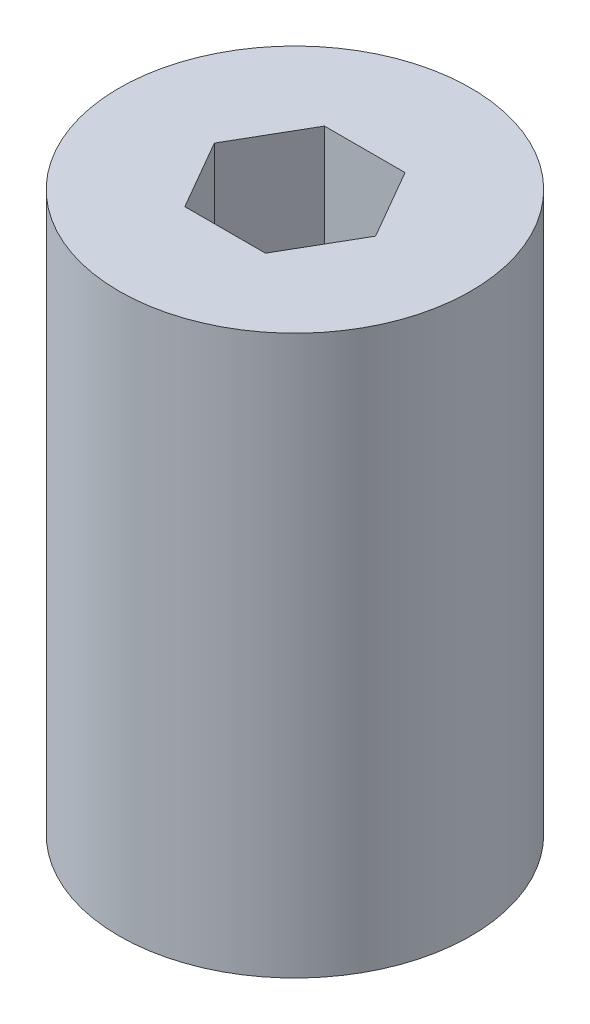
ISO-10303-21;
HEADER;
FILE_DESCRIPTION(('STEP AP214'),'2;1');
FILE_NAME('part.step','',(''),(''),'','','');
FILE_SCHEMA(('AUTOMOTIVE_DESIGN { 1 0 10303 214 1 1 1 1 }'));
ENDSEC;
DATA;
#1=APPLICATION_CONTEXT('core data for automotive mechanical design processes');
#2=APPLICATION_PROTOCOL_DEFINITION('international standard','automotive_design',2000,#1);
#3=PRODUCT_CONTEXT('',#1,'mechanical');
#4=PRODUCT('Part','Part','',(#3));
#5=PRODUCT_RELATED_PRODUCT_CATEGORY('part','',(#4));
#6=PRODUCT_DEFINITION_FORMATION('','',#4);
#7=PRODUCT_DEFINITION_CONTEXT('part definition',#1,'design');
#8=PRODUCT_DEFINITION('design','',#6,#7);
#9=PRODUCT_DEFINITION_SHAPE('','',#8);
#10=(LENGTH_UNIT() NAMED_UNIT(*) SI_UNIT(.MILLI.,.METRE.));
#11=(NAMED_UNIT(*) PLANE_ANGLE_UNIT() SI_UNIT($,.RADIAN.));
#12=(NAMED_UNIT(*) SI_UNIT($,.STERADIAN.) SOLID_ANGLE_UNIT());
#13=UNCERTAINTY_MEASURE_WITH_UNIT(LENGTH_MEASURE(1.E-05),#10,'distance_accuracy_value','');
#14=(GEOMETRIC_REPRESENTATION_CONTEXT(3) GLOBAL_UNCERTAINTY_ASSIGNED_CONTEXT((#13)) GLOBAL_UNIT_ASSIGNED_CONTEXT((#10,
#11,#12)) REPRESENTATION_CONTEXT('',''));
#15=CARTESIAN_POINT('',(0.,0.,0.));
#16=DIRECTION('',(0.,0.,1.));
#17=DIRECTION('',(1.,0.,0.));
#18=AXIS2_PLACEMENT_3D('',#15,#16,#17);
#19=CARTESIAN_POINT('',(0.,50.8,0.));
#20=DIRECTION('',(0.,-1.,0.));
#21=DIRECTION('',(0.,0.,-1.));
#22=AXIS2_PLACEMENT_3D('',#19,#20,#21);
#23=CYLINDRICAL_SURFACE('',#22,16.002);
#24=CARTESIAN_POINT('',(0.,50.8,0.));
#25=DIRECTION('',(0.,1.,0.));
#26=DIRECTION('',(0.,0.,1.));
#27=AXIS2_PLACEMENT_3D('',#24,#25,#26);
#28=CIRCLE('',#27,16.002);
#29=CARTESIAN_POINT('',(0.,50.8,16.002));
#30=VERTEX_POINT('',#29);
#31=EDGE_CURVE('E11',#30,#30,#28,.T.);
#32=ORIENTED_EDGE('',*,*,#31,.F.);
#33=EDGE_LOOP('',(#32));
#34=FACE_BOUND('',#33,.T.);
#35=CARTESIAN_POINT('',(0.,0.,0.));
#36=DIRECTION('',(0.,1.,0.));
#37=DIRECTION('',(0.,0.,1.));
#38=AXIS2_PLACEMENT_3D('',#35,#36,#37);
#39=CIRCLE('',#38,16.002);
#40=CARTESIAN_POINT('',(0.,0.,16.002));
#41=VERTEX_POINT('',#40);
#42=EDGE_CURVE('E36',#41,#41,#39,.T.);
#43=ORIENTED_EDGE('',*,*,#42,.T.);
#44=EDGE_LOOP('',(#43));
#45=FACE_BOUND('',#44,.T.);
#46=ADVANCED_FACE('F33',(#34,#45),#23,.T.);
#47=CARTESIAN_POINT('',(0.,50.8,0.));
#48=DIRECTION('',(0.,1.,0.));
#49=DIRECTION('',(0.,0.,1.));
#50=AXIS2_PLACEMENT_3D('',#47,#48,#49);
#51=PLANE('',#50);
#52=DIRECTION('',(0.5,0.,-0.866025403784439));
#53=VECTOR('',#52,1.);
#54=CARTESIAN_POINT('',(3.66617420935413,50.8,6.35000000000001));
#55=LINE('',#54,#53);
#56=CARTESIAN_POINT('',(3.66617420935413,50.8,6.35000000000001));
#57=VERTEX_POINT('',#56);
#58=CARTESIAN_POINT('',(7.33234841870825,50.8,0.));
#59=VERTEX_POINT('',#58);
#60=EDGE_CURVE('E47',#57,#59,#55,.T.);
#61=ORIENTED_EDGE('',*,*,#60,.F.);
#62=DIRECTION('',(1.,0.,0.));
#63=VECTOR('',#62,1.);
#64=CARTESIAN_POINT('',(-3.66617420935412,50.8,6.35000000000001));
#65=LINE('',#64,#63);
#66=CARTESIAN_POINT('',(-3.66617420935412,50.8,6.35000000000001));
#67=VERTEX_POINT('',#66);
#68=EDGE_CURVE('E104',#67,#57,#65,.T.);
#69=ORIENTED_EDGE('',*,*,#68,.F.);
#70=DIRECTION('',(0.5,0.,0.866025403784439));
#71=VECTOR('',#70,1.);
#72=CARTESIAN_POINT('',(-7.33234841870825,50.8,0.));
#73=LINE('',#72,#71);
#74=CARTESIAN_POINT('',(-7.33234841870825,50.8,0.));
#75=VERTEX_POINT('',#74);
#76=EDGE_CURVE('E107',#75,#67,#73,.T.);
#77=ORIENTED_EDGE('',*,*,#76,.F.);
#78=DIRECTION('',(-0.5,0.,0.866025403784439));
#79=VECTOR('',#78,1.);
#80=CARTESIAN_POINT('',(-3.66617420935413,50.8,-6.35));
#81=LINE('',#80,#79);
#82=CARTESIAN_POINT('',(-3.66617420935413,50.8,-6.35));
#83=VERTEX_POINT('',#82);
#84=EDGE_CURVE('E123',#83,#75,#81,.T.);
#85=ORIENTED_EDGE('',*,*,#84,.F.);
#86=DIRECTION('',(-1.,0.,0.));
#87=VECTOR('',#86,1.);
#88=CARTESIAN_POINT('',(3.66617420935412,50.8,-6.35000000000001));
#89=LINE('',#88,#87);
#90=CARTESIAN_POINT('',(3.66617420935412,50.8,-6.35000000000001));
#91=VERTEX_POINT('',#90);
#92=EDGE_CURVE('E120',#91,#83,#89,.T.);
#93=ORIENTED_EDGE('',*,*,#92,.F.);
#94=DIRECTION('',(-0.5,0.,-0.866025403784439));
#95=VECTOR('',#94,1.);
#96=CARTESIAN_POINT('',(7.33234841870825,50.8,0.));
#97=LINE('',#96,#95);
#98=EDGE_CURVE('E118',#59,#91,#97,.T.);
#99=ORIENTED_EDGE('',*,*,#98,.F.);
#100=EDGE_LOOP('',(#61,#69,#77,#85,#93,#99));
#101=FACE_BOUND('',#100,.T.);
#102=ORIENTED_EDGE('',*,*,#31,.T.);
#103=EDGE_LOOP('',(#102));
#104=FACE_BOUND('',#103,.T.);
#105=ADVANCED_FACE('F140',(#101,#104),#51,.T.);
#106=CARTESIAN_POINT('',(0.,0.,0.));
#107=DIRECTION('',(0.,1.,0.));
#108=DIRECTION('',(0.,0.,1.));
#109=AXIS2_PLACEMENT_3D('',#106,#107,#108);
#110=PLANE('',#109);
#111=DIRECTION('',(1.,0.,0.));
#112=VECTOR('',#111,1.);
#113=CARTESIAN_POINT('',(-3.66617420935412,0.,6.35000000000001));
#114=LINE('',#113,#112);
#115=CARTESIAN_POINT('',(-3.66617420935412,0.,6.35000000000001));
#116=VERTEX_POINT('',#115);
#117=CARTESIAN_POINT('',(3.66617420935413,0.,6.35000000000001));
#118=VERTEX_POINT('',#117);
#119=EDGE_CURVE('E93',#116,#118,#114,.T.);
#120=ORIENTED_EDGE('',*,*,#119,.T.);
#121=DIRECTION('',(0.5,0.,-0.866025403784439));
#122=VECTOR('',#121,1.);
#123=CARTESIAN_POINT('',(3.66617420935413,0.,6.35000000000001));
#124=LINE('',#123,#122);
#125=CARTESIAN_POINT('',(7.33234841870825,0.,0.));
#126=VERTEX_POINT('',#125);
#127=EDGE_CURVE('E87',#118,#126,#124,.T.);
#128=ORIENTED_EDGE('',*,*,#127,.T.);
#129=DIRECTION('',(-0.5,0.,-0.866025403784439));
#130=VECTOR('',#129,1.);
#131=CARTESIAN_POINT('',(7.33234841870825,0.,0.));
#132=LINE('',#131,#130);
#133=CARTESIAN_POINT('',(3.66617420935413,0.,-6.35));
#134=VERTEX_POINT('',#133);
#135=EDGE_CURVE('E96',#126,#134,#132,.T.);
#136=ORIENTED_EDGE('',*,*,#135,.T.);
#137=DIRECTION('',(-1.,0.,0.));
#138=VECTOR('',#137,1.);
#139=CARTESIAN_POINT('',(3.66617420935412,0.,-6.35000000000001));
#140=LINE('',#139,#138);
#141=CARTESIAN_POINT('',(-3.66617420935413,0.,-6.35));
#142=VERTEX_POINT('',#141);
#143=EDGE_CURVE('E55',#134,#142,#140,.T.);
#144=ORIENTED_EDGE('',*,*,#143,.T.);
#145=DIRECTION('',(-0.5,0.,0.866025403784439));
#146=VECTOR('',#145,1.);
#147=CARTESIAN_POINT('',(-3.66617420935413,0.,-6.35));
#148=LINE('',#147,#146);
#149=CARTESIAN_POINT('',(-7.33234841870825,0.,0.));
#150=VERTEX_POINT('',#149);
#151=EDGE_CURVE('E111',#142,#150,#148,.T.);
#152=ORIENTED_EDGE('',*,*,#151,.T.);
#153=DIRECTION('',(0.5,0.,0.866025403784439));
#154=VECTOR('',#153,1.);
#155=CARTESIAN_POINT('',(-7.33234841870825,0.,0.));
#156=LINE('',#155,#154);
#157=EDGE_CURVE('E114',#150,#116,#156,.T.);
#158=ORIENTED_EDGE('',*,*,#157,.T.);
#159=EDGE_LOOP('',(#120,#128,#136,#144,#152,#158));
#160=FACE_BOUND('',#159,.T.);
#161=ORIENTED_EDGE('',*,*,#42,.F.);
#162=EDGE_LOOP('',(#161));
#163=FACE_BOUND('',#162,.T.);
#164=ADVANCED_FACE('F100',(#160,#163),#110,.F.);
#165=CARTESIAN_POINT('',(3.66617420935413,0.,6.35000000000001));
#166=DIRECTION('',(0.866025403784439,0.,0.5));
#167=DIRECTION('',(0.5,0.,-0.866025403784439));
#168=AXIS2_PLACEMENT_3D('',#165,#166,#167);
#169=PLANE('',#168);
#170=ORIENTED_EDGE('',*,*,#60,.T.);
#171=DIRECTION('',(0.,1.,0.));
#172=VECTOR('',#171,1.);
#173=CARTESIAN_POINT('',(7.33234841870825,0.,0.));
#174=LINE('',#173,#172);
#175=EDGE_CURVE('E83',#126,#59,#174,.T.);
#176=ORIENTED_EDGE('',*,*,#175,.F.);
#177=ORIENTED_EDGE('',*,*,#127,.F.);
#178=DIRECTION('',(0.,1.,0.));
#179=VECTOR('',#178,1.);
#180=CARTESIAN_POINT('',(3.66617420935413,0.,6.35000000000001));
#181=LINE('',#180,#179);
#182=EDGE_CURVE('E128',#118,#57,#181,.T.);
#183=ORIENTED_EDGE('',*,*,#182,.T.);
#184=EDGE_LOOP('',(#170,#176,#177,#183));
#185=FACE_BOUND('',#184,.T.);
#186=ADVANCED_FACE('F85',(#185),#169,.F.);
#187=CARTESIAN_POINT('',(-3.66617420935412,0.,6.35000000000001));
#188=DIRECTION('',(0.,0.,1.));
#189=DIRECTION('',(1.,0.,0.));
#190=AXIS2_PLACEMENT_3D('',#187,#188,#189);
#191=PLANE('',#190);
#192=ORIENTED_EDGE('',*,*,#68,.T.);
#193=ORIENTED_EDGE('',*,*,#182,.F.);
#194=ORIENTED_EDGE('',*,*,#119,.F.);
#195=DIRECTION('',(0.,1.,0.));
#196=VECTOR('',#195,1.);
#197=CARTESIAN_POINT('',(-3.66617420935412,0.,6.35000000000001));
#198=LINE('',#197,#196);
#199=EDGE_CURVE('E130',#116,#67,#198,.T.);
#200=ORIENTED_EDGE('',*,*,#199,.T.);
#201=EDGE_LOOP('',(#192,#193,#194,#200));
#202=FACE_BOUND('',#201,.T.);
#203=ADVANCED_FACE('F151',(#202),#191,.F.);
#204=CARTESIAN_POINT('',(-7.33234841870825,0.,0.));
#205=DIRECTION('',(-0.866025403784439,0.,0.5));
#206=DIRECTION('',(0.5,0.,0.866025403784439));
#207=AXIS2_PLACEMENT_3D('',#204,#205,#206);
#208=PLANE('',#207);
#209=ORIENTED_EDGE('',*,*,#76,.T.);
#210=ORIENTED_EDGE('',*,*,#199,.F.);
#211=ORIENTED_EDGE('',*,*,#157,.F.);
#212=DIRECTION('',(0.,1.,0.));
#213=VECTOR('',#212,1.);
#214=CARTESIAN_POINT('',(-7.33234841870825,0.,0.));
#215=LINE('',#214,#213);
#216=EDGE_CURVE('E132',#150,#75,#215,.T.);
#217=ORIENTED_EDGE('',*,*,#216,.T.);
#218=EDGE_LOOP('',(#209,#210,#211,#217));
#219=FACE_BOUND('',#218,.T.);
#220=ADVANCED_FACE('F149',(#219),#208,.F.);
#221=CARTESIAN_POINT('',(-3.66617420935413,0.,-6.35));
#222=DIRECTION('',(-0.866025403784439,0.,-0.5));
#223=DIRECTION('',(-0.5,0.,0.866025403784439));
#224=AXIS2_PLACEMENT_3D('',#221,#222,#223);
#225=PLANE('',#224);
#226=ORIENTED_EDGE('',*,*,#84,.T.);
#227=ORIENTED_EDGE('',*,*,#216,.F.);
#228=ORIENTED_EDGE('',*,*,#151,.F.);
#229=DIRECTION('',(0.,1.,0.));
#230=VECTOR('',#229,1.);
#231=CARTESIAN_POINT('',(-3.66617420935413,0.,-6.35));
#232=LINE('',#231,#230);
#233=EDGE_CURVE('E134',#142,#83,#232,.T.);
#234=ORIENTED_EDGE('',*,*,#233,.T.);
#235=EDGE_LOOP('',(#226,#227,#228,#234));
#236=FACE_BOUND('',#235,.T.);
#237=ADVANCED_FACE('F145',(#236),#225,.F.);
#238=CARTESIAN_POINT('',(3.66617420935412,0.,-6.35000000000001));
#239=DIRECTION('',(0.,0.,-1.));
#240=DIRECTION('',(-1.,0.,0.));
#241=AXIS2_PLACEMENT_3D('',#238,#239,#240);
#242=PLANE('',#241);
#243=ORIENTED_EDGE('',*,*,#92,.T.);
#244=ORIENTED_EDGE('',*,*,#233,.F.);
#245=ORIENTED_EDGE('',*,*,#143,.F.);
#246=DIRECTION('',(0.,1.,0.));
#247=VECTOR('',#246,1.);
#248=CARTESIAN_POINT('',(3.66617420935412,0.,-6.35000000000001));
#249=LINE('',#248,#247);
#250=EDGE_CURVE('E92',#134,#91,#249,.T.);
#251=ORIENTED_EDGE('',*,*,#250,.T.);
#252=EDGE_LOOP('',(#243,#244,#245,#251));
#253=FACE_BOUND('',#252,.T.);
#254=ADVANCED_FACE('F136',(#253),#242,.F.);
#255=CARTESIAN_POINT('',(7.33234841870825,0.,0.));
#256=DIRECTION('',(0.866025403784439,0.,-0.5));
#257=DIRECTION('',(-0.5,0.,-0.866025403784439));
#258=AXIS2_PLACEMENT_3D('',#255,#256,#257);
#259=PLANE('',#258);
#260=ORIENTED_EDGE('',*,*,#98,.T.);
#261=ORIENTED_EDGE('',*,*,#250,.F.);
#262=ORIENTED_EDGE('',*,*,#135,.F.);
#263=ORIENTED_EDGE('',*,*,#175,.T.);
#264=EDGE_LOOP('',(#260,#261,#262,#263));
#265=FACE_BOUND('',#264,.T.);
#266=ADVANCED_FACE('F97',(#265),#259,.F.);
#267=CLOSED_SHELL('',(#46,#105,#164,#186,#203,#220,#237,#254,#266));
#268=MANIFOLD_SOLID_BREP('B2',#267);
#269=ADVANCED_BREP_SHAPE_REPRESENTATION('',(#18,#268),#14);
#270=SHAPE_DEFINITION_REPRESENTATION(#9,#269);
ENDSEC;
END-ISO-10303-21;
